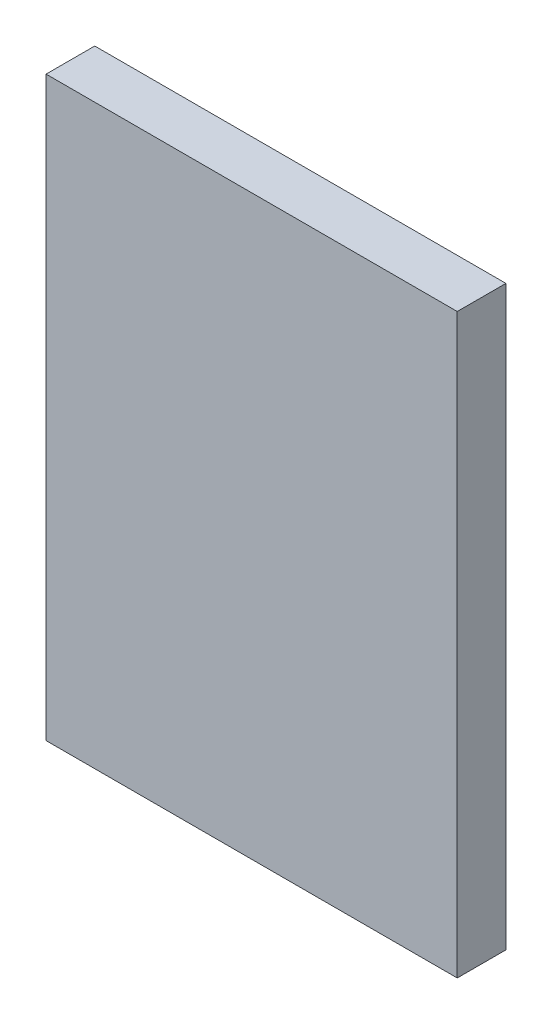
ISO-10303-21;
HEADER;
FILE_DESCRIPTION(('STEP AP214'),'2;1');
FILE_NAME('part.step','',(''),(''),'','','');
FILE_SCHEMA(('AUTOMOTIVE_DESIGN { 1 0 10303 214 1 1 1 1 }'));
ENDSEC;
DATA;
#1=APPLICATION_CONTEXT('core data for automotive mechanical design processes');
#2=APPLICATION_PROTOCOL_DEFINITION('international standard','automotive_design',2000,#1);
#3=PRODUCT_CONTEXT('',#1,'mechanical');
#4=PRODUCT('Part','Part','',(#3));
#5=PRODUCT_RELATED_PRODUCT_CATEGORY('part','',(#4));
#6=PRODUCT_DEFINITION_FORMATION('','',#4);
#7=PRODUCT_DEFINITION_CONTEXT('part definition',#1,'design');
#8=PRODUCT_DEFINITION('design','',#6,#7);
#9=PRODUCT_DEFINITION_SHAPE('','',#8);
#10=(LENGTH_UNIT() NAMED_UNIT(*) SI_UNIT(.MILLI.,.METRE.));
#11=(NAMED_UNIT(*) PLANE_ANGLE_UNIT() SI_UNIT($,.RADIAN.));
#12=(NAMED_UNIT(*) SI_UNIT($,.STERADIAN.) SOLID_ANGLE_UNIT());
#13=UNCERTAINTY_MEASURE_WITH_UNIT(LENGTH_MEASURE(1.E-05),#10,'distance_accuracy_value','');
#14=(GEOMETRIC_REPRESENTATION_CONTEXT(3) GLOBAL_UNCERTAINTY_ASSIGNED_CONTEXT((#13)) GLOBAL_UNIT_ASSIGNED_CONTEXT((#10,
#11,#12)) REPRESENTATION_CONTEXT('',''));
#15=CARTESIAN_POINT('',(0.,0.,0.));
#16=DIRECTION('',(0.,0.,1.));
#17=DIRECTION('',(1.,0.,0.));
#18=AXIS2_PLACEMENT_3D('',#15,#16,#17);
#19=CARTESIAN_POINT('',(-26.8224,-37.6555,6.35));
#20=DIRECTION('',(1.,0.,0.));
#21=DIRECTION('',(0.,0.,-1.));
#22=AXIS2_PLACEMENT_3D('',#19,#20,#21);
#23=PLANE('',#22);
#24=DIRECTION('',(0.,-1.,0.));
#25=VECTOR('',#24,1.);
#26=CARTESIAN_POINT('',(-26.8224,-37.6555,0.));
#27=LINE('',#26,#25);
#28=CARTESIAN_POINT('',(-26.8224,37.6555,0.));
#29=VERTEX_POINT('',#28);
#30=CARTESIAN_POINT('',(-26.8224,-37.6555,0.));
#31=VERTEX_POINT('',#30);
#32=EDGE_CURVE('E102',#29,#31,#27,.T.);
#33=ORIENTED_EDGE('',*,*,#32,.T.);
#34=DIRECTION('',(0.,0.,-1.));
#35=VECTOR('',#34,1.);
#36=CARTESIAN_POINT('',(-26.8224,-37.6555,6.35));
#37=LINE('',#36,#35);
#38=CARTESIAN_POINT('',(-26.8224,-37.6555,6.35));
#39=VERTEX_POINT('',#38);
#40=EDGE_CURVE('E11',#39,#31,#37,.T.);
#41=ORIENTED_EDGE('',*,*,#40,.F.);
#42=DIRECTION('',(0.,-1.,0.));
#43=VECTOR('',#42,1.);
#44=CARTESIAN_POINT('',(-26.8224,-37.6555,6.35));
#45=LINE('',#44,#43);
#46=CARTESIAN_POINT('',(-26.8224,37.6555,6.35));
#47=VERTEX_POINT('',#46);
#48=EDGE_CURVE('E90',#47,#39,#45,.T.);
#49=ORIENTED_EDGE('',*,*,#48,.F.);
#50=DIRECTION('',(0.,0.,-1.));
#51=VECTOR('',#50,1.);
#52=CARTESIAN_POINT('',(-26.8224,37.6555,6.35));
#53=LINE('',#52,#51);
#54=EDGE_CURVE('E98',#47,#29,#53,.T.);
#55=ORIENTED_EDGE('',*,*,#54,.T.);
#56=EDGE_LOOP('',(#33,#41,#49,#55));
#57=FACE_BOUND('',#56,.T.);
#58=ADVANCED_FACE('F39',(#57),#23,.F.);
#59=CARTESIAN_POINT('',(26.8224,-37.6555,6.35));
#60=DIRECTION('',(0.,1.,0.));
#61=DIRECTION('',(0.,0.,1.));
#62=AXIS2_PLACEMENT_3D('',#59,#60,#61);
#63=PLANE('',#62);
#64=DIRECTION('',(1.,0.,0.));
#65=VECTOR('',#64,1.);
#66=CARTESIAN_POINT('',(26.8224,-37.6555,0.));
#67=LINE('',#66,#65);
#68=CARTESIAN_POINT('',(26.8224,-37.6555,0.));
#69=VERTEX_POINT('',#68);
#70=EDGE_CURVE('E94',#31,#69,#67,.T.);
#71=ORIENTED_EDGE('',*,*,#70,.T.);
#72=DIRECTION('',(0.,0.,-1.));
#73=VECTOR('',#72,1.);
#74=CARTESIAN_POINT('',(26.8224,-37.6555,6.35));
#75=LINE('',#74,#73);
#76=CARTESIAN_POINT('',(26.8224,-37.6555,6.35));
#77=VERTEX_POINT('',#76);
#78=EDGE_CURVE('E47',#77,#69,#75,.T.);
#79=ORIENTED_EDGE('',*,*,#78,.F.);
#80=DIRECTION('',(1.,0.,0.));
#81=VECTOR('',#80,1.);
#82=CARTESIAN_POINT('',(26.8224,-37.6555,6.35));
#83=LINE('',#82,#81);
#84=EDGE_CURVE('E85',#39,#77,#83,.T.);
#85=ORIENTED_EDGE('',*,*,#84,.F.);
#86=ORIENTED_EDGE('',*,*,#40,.T.);
#87=EDGE_LOOP('',(#71,#79,#85,#86));
#88=FACE_BOUND('',#87,.T.);
#89=ADVANCED_FACE('F93',(#88),#63,.F.);
#90=CARTESIAN_POINT('',(26.8224,-37.6555,6.35));
#91=DIRECTION('',(-1.,0.,0.));
#92=DIRECTION('',(0.,0.,1.));
#93=AXIS2_PLACEMENT_3D('',#90,#91,#92);
#94=PLANE('',#93);
#95=DIRECTION('',(0.,1.,0.));
#96=VECTOR('',#95,1.);
#97=CARTESIAN_POINT('',(26.8224,-37.6555,0.));
#98=LINE('',#97,#96);
#99=CARTESIAN_POINT('',(26.8224,37.6555,0.));
#100=VERTEX_POINT('',#99);
#101=EDGE_CURVE('E72',#69,#100,#98,.T.);
#102=ORIENTED_EDGE('',*,*,#101,.T.);
#103=DIRECTION('',(0.,0.,-1.));
#104=VECTOR('',#103,1.);
#105=CARTESIAN_POINT('',(26.8224,37.6555,6.35));
#106=LINE('',#105,#104);
#107=CARTESIAN_POINT('',(26.8224,37.6555,6.35));
#108=VERTEX_POINT('',#107);
#109=EDGE_CURVE('E95',#108,#100,#106,.T.);
#110=ORIENTED_EDGE('',*,*,#109,.F.);
#111=DIRECTION('',(0.,1.,0.));
#112=VECTOR('',#111,1.);
#113=CARTESIAN_POINT('',(26.8224,-37.6555,6.35));
#114=LINE('',#113,#112);
#115=EDGE_CURVE('E88',#77,#108,#114,.T.);
#116=ORIENTED_EDGE('',*,*,#115,.F.);
#117=ORIENTED_EDGE('',*,*,#78,.T.);
#118=EDGE_LOOP('',(#102,#110,#116,#117));
#119=FACE_BOUND('',#118,.T.);
#120=ADVANCED_FACE('F96',(#119),#94,.F.);
#121=CARTESIAN_POINT('',(26.8224,37.6555,6.35));
#122=DIRECTION('',(0.,-1.,0.));
#123=DIRECTION('',(0.,0.,-1.));
#124=AXIS2_PLACEMENT_3D('',#121,#122,#123);
#125=PLANE('',#124);
#126=DIRECTION('',(-1.,0.,0.));
#127=VECTOR('',#126,1.);
#128=CARTESIAN_POINT('',(26.8224,37.6555,0.));
#129=LINE('',#128,#127);
#130=EDGE_CURVE('E78',#100,#29,#129,.T.);
#131=ORIENTED_EDGE('',*,*,#130,.T.);
#132=ORIENTED_EDGE('',*,*,#54,.F.);
#133=DIRECTION('',(-1.,0.,0.));
#134=VECTOR('',#133,1.);
#135=CARTESIAN_POINT('',(26.8224,37.6555,6.35));
#136=LINE('',#135,#134);
#137=EDGE_CURVE('E55',#108,#47,#136,.T.);
#138=ORIENTED_EDGE('',*,*,#137,.F.);
#139=ORIENTED_EDGE('',*,*,#109,.T.);
#140=EDGE_LOOP('',(#131,#132,#138,#139));
#141=FACE_BOUND('',#140,.T.);
#142=ADVANCED_FACE('F109',(#141),#125,.F.);
#143=CARTESIAN_POINT('',(0.,0.,6.35));
#144=DIRECTION('',(0.,0.,1.));
#145=DIRECTION('',(1.,0.,0.));
#146=AXIS2_PLACEMENT_3D('',#143,#144,#145);
#147=PLANE('',#146);
#148=ORIENTED_EDGE('',*,*,#48,.T.);
#149=ORIENTED_EDGE('',*,*,#84,.T.);
#150=ORIENTED_EDGE('',*,*,#115,.T.);
#151=ORIENTED_EDGE('',*,*,#137,.T.);
#152=EDGE_LOOP('',(#148,#149,#150,#151));
#153=FACE_BOUND('',#152,.T.);
#154=ADVANCED_FACE('F86',(#153),#147,.T.);
#155=CARTESIAN_POINT('',(0.,0.,0.));
#156=DIRECTION('',(0.,0.,1.));
#157=DIRECTION('',(1.,0.,0.));
#158=AXIS2_PLACEMENT_3D('',#155,#156,#157);
#159=PLANE('',#158);
#160=ORIENTED_EDGE('',*,*,#32,.F.);
#161=ORIENTED_EDGE('',*,*,#130,.F.);
#162=ORIENTED_EDGE('',*,*,#101,.F.);
#163=ORIENTED_EDGE('',*,*,#70,.F.);
#164=EDGE_LOOP('',(#160,#161,#162,#163));
#165=FACE_BOUND('',#164,.T.);
#166=ADVANCED_FACE('F112',(#165),#159,.F.);
#167=CLOSED_SHELL('',(#58,#89,#120,#142,#154,#166));
#168=MANIFOLD_SOLID_BREP('B2',#167);
#169=ADVANCED_BREP_SHAPE_REPRESENTATION('',(#18,#168),#14);
#170=SHAPE_DEFINITION_REPRESENTATION(#9,#169);
ENDSEC;
END-ISO-10303-21;
